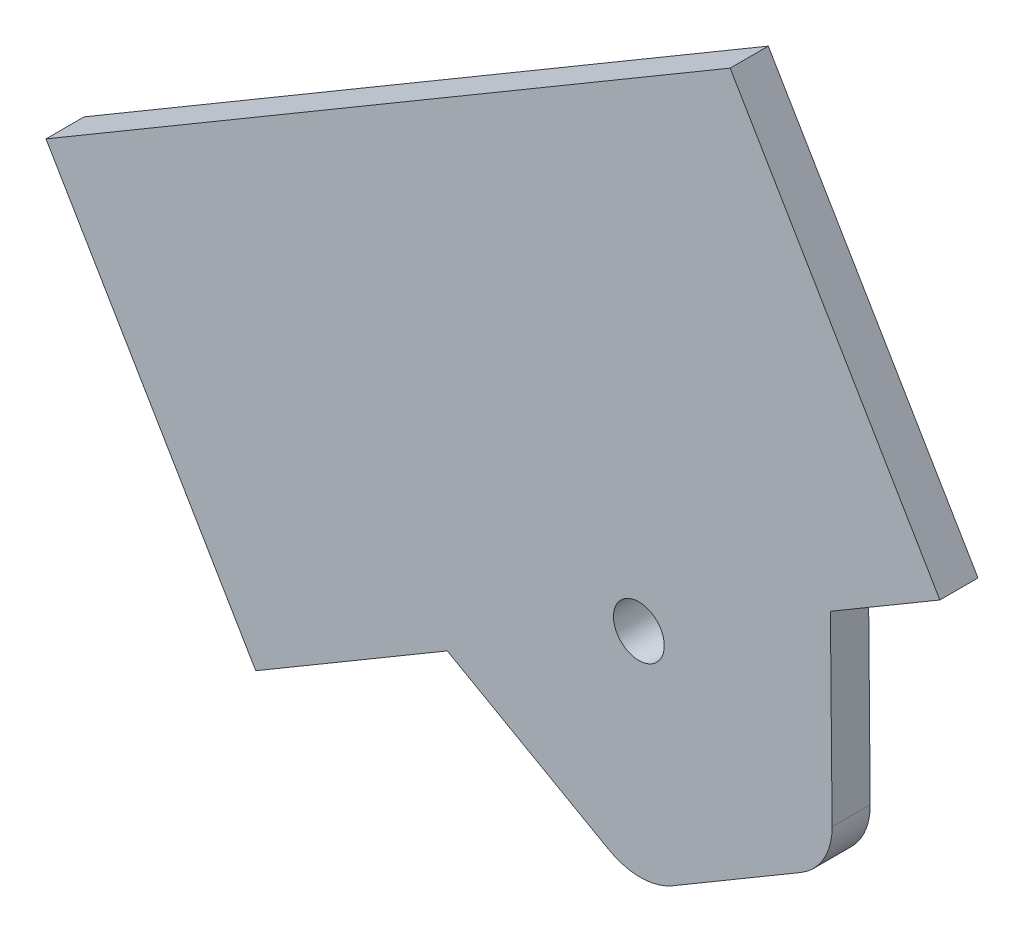
ISO-10303-21;
HEADER;
FILE_DESCRIPTION(('STEP AP214'),'2;1');
FILE_NAME('part.step','',(''),(''),'','','');
FILE_SCHEMA(('AUTOMOTIVE_DESIGN { 1 0 10303 214 1 1 1 1 }'));
ENDSEC;
DATA;
#1=APPLICATION_CONTEXT('core data for automotive mechanical design processes');
#2=APPLICATION_PROTOCOL_DEFINITION('international standard','automotive_design',2000,#1);
#3=PRODUCT_CONTEXT('',#1,'mechanical');
#4=PRODUCT('Part','Part','',(#3));
#5=PRODUCT_RELATED_PRODUCT_CATEGORY('part','',(#4));
#6=PRODUCT_DEFINITION_FORMATION('','',#4);
#7=PRODUCT_DEFINITION_CONTEXT('part definition',#1,'design');
#8=PRODUCT_DEFINITION('design','',#6,#7);
#9=PRODUCT_DEFINITION_SHAPE('','',#8);
#10=(LENGTH_UNIT() NAMED_UNIT(*) SI_UNIT(.MILLI.,.METRE.));
#11=(NAMED_UNIT(*) PLANE_ANGLE_UNIT() SI_UNIT($,.RADIAN.));
#12=(NAMED_UNIT(*) SI_UNIT($,.STERADIAN.) SOLID_ANGLE_UNIT());
#13=UNCERTAINTY_MEASURE_WITH_UNIT(LENGTH_MEASURE(1.E-05),#10,'distance_accuracy_value','');
#14=(GEOMETRIC_REPRESENTATION_CONTEXT(3) GLOBAL_UNCERTAINTY_ASSIGNED_CONTEXT((#13)) GLOBAL_UNIT_ASSIGNED_CONTEXT((#10,
#11,#12)) REPRESENTATION_CONTEXT('',''));
#15=CARTESIAN_POINT('',(0.,0.,0.));
#16=DIRECTION('',(0.,0.,1.));
#17=DIRECTION('',(1.,0.,0.));
#18=AXIS2_PLACEMENT_3D('',#15,#16,#17);
#19=CARTESIAN_POINT('',(48.5215928811071,334.718954291785,6.));
#20=DIRECTION('',(0.,0.,1.));
#21=DIRECTION('',(1.,0.,0.));
#22=AXIS2_PLACEMENT_3D('',#19,#20,#21);
#23=PLANE('',#22);
#24=DIRECTION('',(0.861436542464988,0.507865221595225,0.));
#25=VECTOR('',#24,1.);
#26=CARTESIAN_POINT('',(78.4583109537115,375.946259310141,6.));
#27=LINE('',#26,#25);
#28=CARTESIAN_POINT('',(78.4583109537115,375.946259310141,6.));
#29=VERTEX_POINT('',#28);
#30=CARTESIAN_POINT('',(95.6870418030112,386.103563742045,6.));
#31=VERTEX_POINT('',#30);
#32=EDGE_CURVE('E168',#29,#31,#27,.T.);
#33=ORIENTED_EDGE('',*,*,#32,.T.);
#34=DIRECTION('',(-0.507865221595228,0.861436542464986,0.));
#35=VECTOR('',#34,1.);
#36=CARTESIAN_POINT('',(95.6870418030112,386.103563742045,6.));
#37=LINE('',#36,#35);
#38=CARTESIAN_POINT('',(62.6758023993214,442.096939002269,6.));
#39=VERTEX_POINT('',#38);
#40=EDGE_CURVE('E106',#31,#39,#37,.T.);
#41=ORIENTED_EDGE('',*,*,#40,.T.);
#42=DIRECTION('',(-0.861436542465423,-0.507865221594487,0.));
#43=VECTOR('',#42,1.);
#44=CARTESIAN_POINT('',(62.6758023993214,442.096939002269,6.));
#45=LINE('',#44,#43);
#46=CARTESIAN_POINT('',(-45.0037654088565,378.613786302958,6.));
#47=VERTEX_POINT('',#46);
#48=EDGE_CURVE('E189',#39,#47,#45,.T.);
#49=ORIENTED_EDGE('',*,*,#48,.T.);
#50=DIRECTION('',(0.507865221595247,-0.861436542464975,0.));
#51=VECTOR('',#50,1.);
#52=CARTESIAN_POINT('',(-45.0037654088565,378.613786302958,6.));
#53=LINE('',#52,#51);
#54=CARTESIAN_POINT('',(-11.9925260051655,322.620411042735,6.));
#55=VERTEX_POINT('',#54);
#56=EDGE_CURVE('E208',#47,#55,#53,.T.);
#57=ORIENTED_EDGE('',*,*,#56,.T.);
#58=DIRECTION('',(0.861436542464983,0.507865221595234,0.));
#59=VECTOR('',#58,1.);
#60=CARTESIAN_POINT('',(-11.9925260051655,322.620411042735,6.));
#61=LINE('',#60,#59);
#62=CARTESIAN_POINT('',(18.1577529811089,340.395693798568,6.));
#63=VERTEX_POINT('',#62);
#64=EDGE_CURVE('E205',#55,#63,#61,.T.);
#65=ORIENTED_EDGE('',*,*,#64,.T.);
#66=DIRECTION('',(0.870542454831801,-0.492093318726663,0.));
#67=VECTOR('',#66,1.);
#68=CARTESIAN_POINT('',(18.1577529811089,340.395693798568,6.));
#69=LINE('',#68,#67);
#70=CARTESIAN_POINT('',(43.6006596938402,326.013529743468,6.));
#71=VERTEX_POINT('',#70);
#72=EDGE_CURVE('E207',#63,#71,#69,.T.);
#73=ORIENTED_EDGE('',*,*,#72,.T.);
#74=CARTESIAN_POINT('',(48.5215928811071,334.718954291785,6.));
#75=DIRECTION('',(0.,0.,1.));
#76=DIRECTION('',(1.,0.,0.));
#77=AXIS2_PLACEMENT_3D('',#74,#75,#76);
#78=CIRCLE('',#77,9.99999999999959);
#79=CARTESIAN_POINT('',(53.6002450970461,326.104588867128,6.));
#80=VERTEX_POINT('',#79);
#81=EDGE_CURVE('E131',#71,#80,#78,.T.);
#82=ORIENTED_EDGE('',*,*,#81,.T.);
#83=DIRECTION('',(0.861436542465769,0.5078652215939,0.));
#84=VECTOR('',#83,1.);
#85=CARTESIAN_POINT('',(53.6002450970461,326.104588867128,6.));
#86=LINE('',#85,#84);
#87=CARTESIAN_POINT('',(73.8035116896998,338.015549174929,6.));
#88=VERTEX_POINT('',#87);
#89=EDGE_CURVE('E125',#80,#88,#86,.T.);
#90=ORIENTED_EDGE('',*,*,#89,.T.);
#91=CARTESIAN_POINT('',(68.7248594737608,346.629914599586,6.));
#92=DIRECTION('',(0.,0.,1.));
#93=DIRECTION('',(1.,0.,0.));
#94=AXIS2_PLACEMENT_3D('',#91,#92,#93);
#95=CIRCLE('',#94,9.99999999999988);
#96=CARTESIAN_POINT('',(78.724444876966,346.720973723247,6.));
#97=VERTEX_POINT('',#96);
#98=EDGE_CURVE('E129',#88,#97,#95,.T.);
#99=ORIENTED_EDGE('',*,*,#98,.T.);
#100=DIRECTION('',(-0.00910591236607605,0.999958540320538,0.));
#101=VECTOR('',#100,1.);
#102=CARTESIAN_POINT('',(78.7244448769664,346.720973723247,6.));
#103=LINE('',#102,#101);
#104=EDGE_CURVE('E57',#97,#29,#103,.T.);
#105=ORIENTED_EDGE('',*,*,#104,.T.);
#106=EDGE_LOOP('',(#33,#41,#49,#57,#65,#73,#82,#90,#99,#105));
#107=FACE_BOUND('',#106,.T.);
#108=CARTESIAN_POINT('',(48.3080319674108,358.170976554355,6.));
#109=DIRECTION('',(0.,0.,1.));
#110=DIRECTION('',(1.,0.,0.));
#111=AXIS2_PLACEMENT_3D('',#108,#109,#110);
#112=CIRCLE('',#111,3.99999999998749);
#113=CARTESIAN_POINT('',(52.3080319673983,358.170976554355,6.));
#114=VERTEX_POINT('',#113);
#115=EDGE_CURVE('E153',#114,#114,#112,.T.);
#116=ORIENTED_EDGE('',*,*,#115,.F.);
#117=EDGE_LOOP('',(#116));
#118=FACE_BOUND('',#117,.T.);
#119=ADVANCED_FACE('F40',(#107,#118),#23,.T.);
#120=CARTESIAN_POINT('',(48.5215928811071,334.718954291785,0.));
#121=DIRECTION('',(0.,0.,1.));
#122=DIRECTION('',(1.,0.,0.));
#123=AXIS2_PLACEMENT_3D('',#120,#121,#122);
#124=PLANE('',#123);
#125=DIRECTION('',(0.861436542464988,0.507865221595225,0.));
#126=VECTOR('',#125,1.);
#127=CARTESIAN_POINT('',(78.4583109537115,375.946259310141,0.));
#128=LINE('',#127,#126);
#129=CARTESIAN_POINT('',(78.4583109537115,375.946259310141,0.));
#130=VERTEX_POINT('',#129);
#131=CARTESIAN_POINT('',(95.6870418030112,386.103563742045,0.));
#132=VERTEX_POINT('',#131);
#133=EDGE_CURVE('E149',#130,#132,#128,.T.);
#134=ORIENTED_EDGE('',*,*,#133,.F.);
#135=DIRECTION('',(-0.00910591236607605,0.999958540320538,0.));
#136=VECTOR('',#135,1.);
#137=CARTESIAN_POINT('',(78.7244448769664,346.720973723247,0.));
#138=LINE('',#137,#136);
#139=CARTESIAN_POINT('',(78.724444876966,346.720973723247,0.));
#140=VERTEX_POINT('',#139);
#141=EDGE_CURVE('E98',#140,#130,#138,.T.);
#142=ORIENTED_EDGE('',*,*,#141,.F.);
#143=CARTESIAN_POINT('',(68.7248594737608,346.629914599586,0.));
#144=DIRECTION('',(0.,0.,1.));
#145=DIRECTION('',(1.,0.,0.));
#146=AXIS2_PLACEMENT_3D('',#143,#144,#145);
#147=CIRCLE('',#146,9.99999999999988);
#148=CARTESIAN_POINT('',(73.8035116896998,338.015549174929,0.));
#149=VERTEX_POINT('',#148);
#150=EDGE_CURVE('E92',#149,#140,#147,.T.);
#151=ORIENTED_EDGE('',*,*,#150,.F.);
#152=DIRECTION('',(0.861436542465769,0.5078652215939,0.));
#153=VECTOR('',#152,1.);
#154=CARTESIAN_POINT('',(53.6002450970461,326.104588867128,0.));
#155=LINE('',#154,#153);
#156=CARTESIAN_POINT('',(53.6002450970461,326.104588867128,0.));
#157=VERTEX_POINT('',#156);
#158=EDGE_CURVE('E139',#157,#149,#155,.T.);
#159=ORIENTED_EDGE('',*,*,#158,.F.);
#160=CARTESIAN_POINT('',(48.5215928811071,334.718954291785,0.));
#161=DIRECTION('',(0.,0.,1.));
#162=DIRECTION('',(1.,0.,0.));
#163=AXIS2_PLACEMENT_3D('',#160,#161,#162);
#164=CIRCLE('',#163,9.99999999999959);
#165=CARTESIAN_POINT('',(43.6006596938402,326.013529743468,0.));
#166=VERTEX_POINT('',#165);
#167=EDGE_CURVE('E163',#166,#157,#164,.T.);
#168=ORIENTED_EDGE('',*,*,#167,.F.);
#169=DIRECTION('',(0.870542454831801,-0.492093318726663,0.));
#170=VECTOR('',#169,1.);
#171=CARTESIAN_POINT('',(18.1577529811089,340.395693798568,0.));
#172=LINE('',#171,#170);
#173=CARTESIAN_POINT('',(18.1577529811089,340.395693798568,0.));
#174=VERTEX_POINT('',#173);
#175=EDGE_CURVE('E161',#174,#166,#172,.T.);
#176=ORIENTED_EDGE('',*,*,#175,.F.);
#177=DIRECTION('',(0.861436542464983,0.507865221595234,0.));
#178=VECTOR('',#177,1.);
#179=CARTESIAN_POINT('',(-11.9925260051655,322.620411042735,0.));
#180=LINE('',#179,#178);
#181=CARTESIAN_POINT('',(-11.9925260051655,322.620411042735,0.));
#182=VERTEX_POINT('',#181);
#183=EDGE_CURVE('E159',#182,#174,#180,.T.);
#184=ORIENTED_EDGE('',*,*,#183,.F.);
#185=DIRECTION('',(0.507865221595247,-0.861436542464975,0.));
#186=VECTOR('',#185,1.);
#187=CARTESIAN_POINT('',(-45.0037654088565,378.613786302958,0.));
#188=LINE('',#187,#186);
#189=CARTESIAN_POINT('',(-45.0037654088565,378.613786302958,0.));
#190=VERTEX_POINT('',#189);
#191=EDGE_CURVE('E157',#190,#182,#188,.T.);
#192=ORIENTED_EDGE('',*,*,#191,.F.);
#193=DIRECTION('',(-0.861436542465423,-0.507865221594487,0.));
#194=VECTOR('',#193,1.);
#195=CARTESIAN_POINT('',(62.6758023993214,442.096939002269,0.));
#196=LINE('',#195,#194);
#197=CARTESIAN_POINT('',(62.6758023993214,442.096939002269,0.));
#198=VERTEX_POINT('',#197);
#199=EDGE_CURVE('E155',#198,#190,#196,.T.);
#200=ORIENTED_EDGE('',*,*,#199,.F.);
#201=DIRECTION('',(-0.507865221595228,0.861436542464986,0.));
#202=VECTOR('',#201,1.);
#203=CARTESIAN_POINT('',(95.6870418030112,386.103563742045,0.));
#204=LINE('',#203,#202);
#205=EDGE_CURVE('E152',#132,#198,#204,.T.);
#206=ORIENTED_EDGE('',*,*,#205,.F.);
#207=EDGE_LOOP('',(#134,#142,#151,#159,#168,#176,#184,#192,#200,#206));
#208=FACE_BOUND('',#207,.T.);
#209=CARTESIAN_POINT('',(48.3080319674108,358.170976554355,0.));
#210=DIRECTION('',(0.,0.,1.));
#211=DIRECTION('',(1.,0.,0.));
#212=AXIS2_PLACEMENT_3D('',#209,#210,#211);
#213=CIRCLE('',#212,3.99999999998749);
#214=CARTESIAN_POINT('',(52.3080319673983,358.170976554355,0.));
#215=VERTEX_POINT('',#214);
#216=EDGE_CURVE('E216',#215,#215,#213,.T.);
#217=ORIENTED_EDGE('',*,*,#216,.T.);
#218=EDGE_LOOP('',(#217));
#219=FACE_BOUND('',#218,.T.);
#220=ADVANCED_FACE('F193',(#208,#219),#124,.F.);
#221=CARTESIAN_POINT('',(78.4583109537115,375.946259310141,6.));
#222=DIRECTION('',(-0.507865221595225,0.861436542464988,0.));
#223=DIRECTION('',(-0.861436542464988,-0.507865221595225,0.));
#224=AXIS2_PLACEMENT_3D('',#221,#222,#223);
#225=PLANE('',#224);
#226=ORIENTED_EDGE('',*,*,#133,.T.);
#227=DIRECTION('',(0.,0.,-1.));
#228=VECTOR('',#227,1.);
#229=CARTESIAN_POINT('',(95.6870418030112,386.103563742045,6.));
#230=LINE('',#229,#228);
#231=EDGE_CURVE('E11',#31,#132,#230,.T.);
#232=ORIENTED_EDGE('',*,*,#231,.F.);
#233=ORIENTED_EDGE('',*,*,#32,.F.);
#234=DIRECTION('',(0.,0.,-1.));
#235=VECTOR('',#234,1.);
#236=CARTESIAN_POINT('',(78.4583109537115,375.946259310141,6.));
#237=LINE('',#236,#235);
#238=EDGE_CURVE('E145',#29,#130,#237,.T.);
#239=ORIENTED_EDGE('',*,*,#238,.T.);
#240=EDGE_LOOP('',(#226,#232,#233,#239));
#241=FACE_BOUND('',#240,.T.);
#242=ADVANCED_FACE('F42',(#241),#225,.F.);
#243=CARTESIAN_POINT('',(95.6870418030112,386.103563742045,6.));
#244=DIRECTION('',(-0.861436542464986,-0.507865221595228,0.));
#245=DIRECTION('',(0.507865221595228,-0.861436542464986,0.));
#246=AXIS2_PLACEMENT_3D('',#243,#244,#245);
#247=PLANE('',#246);
#248=ORIENTED_EDGE('',*,*,#205,.T.);
#249=DIRECTION('',(0.,0.,-1.));
#250=VECTOR('',#249,1.);
#251=CARTESIAN_POINT('',(62.6758023993214,442.096939002269,6.));
#252=LINE('',#251,#250);
#253=EDGE_CURVE('E49',#39,#198,#252,.T.);
#254=ORIENTED_EDGE('',*,*,#253,.F.);
#255=ORIENTED_EDGE('',*,*,#40,.F.);
#256=ORIENTED_EDGE('',*,*,#231,.T.);
#257=EDGE_LOOP('',(#248,#254,#255,#256));
#258=FACE_BOUND('',#257,.T.);
#259=ADVANCED_FACE('F252',(#258),#247,.F.);
#260=CARTESIAN_POINT('',(62.6758023993214,442.096939002269,6.));
#261=DIRECTION('',(0.507865221594487,-0.861436542465423,0.));
#262=DIRECTION('',(0.861436542465423,0.507865221594487,0.));
#263=AXIS2_PLACEMENT_3D('',#260,#261,#262);
#264=PLANE('',#263);
#265=ORIENTED_EDGE('',*,*,#199,.T.);
#266=DIRECTION('',(0.,0.,-1.));
#267=VECTOR('',#266,1.);
#268=CARTESIAN_POINT('',(-45.0037654088565,378.613786302958,6.));
#269=LINE('',#268,#267);
#270=EDGE_CURVE('E181',#47,#190,#269,.T.);
#271=ORIENTED_EDGE('',*,*,#270,.F.);
#272=ORIENTED_EDGE('',*,*,#48,.F.);
#273=ORIENTED_EDGE('',*,*,#253,.T.);
#274=EDGE_LOOP('',(#265,#271,#272,#273));
#275=FACE_BOUND('',#274,.T.);
#276=ADVANCED_FACE('F187',(#275),#264,.F.);
#277=CARTESIAN_POINT('',(-45.0037654088565,378.613786302958,6.));
#278=DIRECTION('',(0.861436542464975,0.507865221595247,0.));
#279=DIRECTION('',(-0.507865221595247,0.861436542464975,0.));
#280=AXIS2_PLACEMENT_3D('',#277,#278,#279);
#281=PLANE('',#280);
#282=ORIENTED_EDGE('',*,*,#191,.T.);
#283=DIRECTION('',(0.,0.,-1.));
#284=VECTOR('',#283,1.);
#285=CARTESIAN_POINT('',(-11.9925260051655,322.620411042735,6.));
#286=LINE('',#285,#284);
#287=EDGE_CURVE('E178',#55,#182,#286,.T.);
#288=ORIENTED_EDGE('',*,*,#287,.F.);
#289=ORIENTED_EDGE('',*,*,#56,.F.);
#290=ORIENTED_EDGE('',*,*,#270,.T.);
#291=EDGE_LOOP('',(#282,#288,#289,#290));
#292=FACE_BOUND('',#291,.T.);
#293=ADVANCED_FACE('F199',(#292),#281,.F.);
#294=CARTESIAN_POINT('',(-11.9925260051655,322.620411042735,6.));
#295=DIRECTION('',(-0.507865221595234,0.861436542464983,0.));
#296=DIRECTION('',(-0.861436542464983,-0.507865221595234,0.));
#297=AXIS2_PLACEMENT_3D('',#294,#295,#296);
#298=PLANE('',#297);
#299=ORIENTED_EDGE('',*,*,#183,.T.);
#300=DIRECTION('',(0.,0.,-1.));
#301=VECTOR('',#300,1.);
#302=CARTESIAN_POINT('',(18.1577529811089,340.395693798568,6.));
#303=LINE('',#302,#301);
#304=EDGE_CURVE('E175',#63,#174,#303,.T.);
#305=ORIENTED_EDGE('',*,*,#304,.F.);
#306=ORIENTED_EDGE('',*,*,#64,.F.);
#307=ORIENTED_EDGE('',*,*,#287,.T.);
#308=EDGE_LOOP('',(#299,#305,#306,#307));
#309=FACE_BOUND('',#308,.T.);
#310=ADVANCED_FACE('F203',(#309),#298,.F.);
#311=CARTESIAN_POINT('',(18.1577529811089,340.395693798568,6.));
#312=DIRECTION('',(0.492093318726663,0.870542454831801,0.));
#313=DIRECTION('',(-0.870542454831801,0.492093318726663,0.));
#314=AXIS2_PLACEMENT_3D('',#311,#312,#313);
#315=PLANE('',#314);
#316=ORIENTED_EDGE('',*,*,#175,.T.);
#317=DIRECTION('',(0.,0.,-1.));
#318=VECTOR('',#317,1.);
#319=CARTESIAN_POINT('',(43.6006596938402,326.013529743468,6.));
#320=LINE('',#319,#318);
#321=EDGE_CURVE('E172',#71,#166,#320,.T.);
#322=ORIENTED_EDGE('',*,*,#321,.F.);
#323=ORIENTED_EDGE('',*,*,#72,.F.);
#324=ORIENTED_EDGE('',*,*,#304,.T.);
#325=EDGE_LOOP('',(#316,#322,#323,#324));
#326=FACE_BOUND('',#325,.T.);
#327=ADVANCED_FACE('F242',(#326),#315,.F.);
#328=CARTESIAN_POINT('',(48.5215928811071,334.718954291785,6.));
#329=DIRECTION('',(0.,0.,-1.));
#330=DIRECTION('',(-1.,0.,0.));
#331=AXIS2_PLACEMENT_3D('',#328,#329,#330);
#332=CYLINDRICAL_SURFACE('',#331,9.99999999999959);
#333=ORIENTED_EDGE('',*,*,#167,.T.);
#334=DIRECTION('',(0.,0.,-1.));
#335=VECTOR('',#334,1.);
#336=CARTESIAN_POINT('',(53.6002450970461,326.104588867128,6.));
#337=LINE('',#336,#335);
#338=EDGE_CURVE('E140',#80,#157,#337,.T.);
#339=ORIENTED_EDGE('',*,*,#338,.F.);
#340=ORIENTED_EDGE('',*,*,#81,.F.);
#341=ORIENTED_EDGE('',*,*,#321,.T.);
#342=EDGE_LOOP('',(#333,#339,#340,#341));
#343=FACE_BOUND('',#342,.T.);
#344=ADVANCED_FACE('F239',(#343),#332,.T.);
#345=CARTESIAN_POINT('',(53.6002450970461,326.104588867128,6.));
#346=DIRECTION('',(-0.5078652215939,0.861436542465769,0.));
#347=DIRECTION('',(-0.861436542465769,-0.5078652215939,0.));
#348=AXIS2_PLACEMENT_3D('',#345,#346,#347);
#349=PLANE('',#348);
#350=ORIENTED_EDGE('',*,*,#158,.T.);
#351=DIRECTION('',(0.,0.,-1.));
#352=VECTOR('',#351,1.);
#353=CARTESIAN_POINT('',(73.8035116896998,338.015549174929,6.));
#354=LINE('',#353,#352);
#355=EDGE_CURVE('E136',#88,#149,#354,.T.);
#356=ORIENTED_EDGE('',*,*,#355,.F.);
#357=ORIENTED_EDGE('',*,*,#89,.F.);
#358=ORIENTED_EDGE('',*,*,#338,.T.);
#359=EDGE_LOOP('',(#350,#356,#357,#358));
#360=FACE_BOUND('',#359,.T.);
#361=ADVANCED_FACE('F137',(#360),#349,.F.);
#362=CARTESIAN_POINT('',(68.7248594737608,346.629914599586,6.));
#363=DIRECTION('',(0.,0.,-1.));
#364=DIRECTION('',(-1.,0.,0.));
#365=AXIS2_PLACEMENT_3D('',#362,#363,#364);
#366=CYLINDRICAL_SURFACE('',#365,9.99999999999988);
#367=ORIENTED_EDGE('',*,*,#150,.T.);
#368=DIRECTION('',(0.,0.,-1.));
#369=VECTOR('',#368,1.);
#370=CARTESIAN_POINT('',(78.724444876966,346.720973723247,6.));
#371=LINE('',#370,#369);
#372=EDGE_CURVE('E141',#97,#140,#371,.T.);
#373=ORIENTED_EDGE('',*,*,#372,.F.);
#374=ORIENTED_EDGE('',*,*,#98,.F.);
#375=ORIENTED_EDGE('',*,*,#355,.T.);
#376=EDGE_LOOP('',(#367,#373,#374,#375));
#377=FACE_BOUND('',#376,.T.);
#378=ADVANCED_FACE('F143',(#377),#366,.T.);
#379=CARTESIAN_POINT('',(78.7244448769664,346.720973723247,6.));
#380=DIRECTION('',(-0.999958540320538,-0.00910591236607605,0.));
#381=DIRECTION('',(0.00910591236607605,-0.999958540320538,0.));
#382=AXIS2_PLACEMENT_3D('',#379,#380,#381);
#383=PLANE('',#382);
#384=ORIENTED_EDGE('',*,*,#141,.T.);
#385=ORIENTED_EDGE('',*,*,#238,.F.);
#386=ORIENTED_EDGE('',*,*,#104,.F.);
#387=ORIENTED_EDGE('',*,*,#372,.T.);
#388=EDGE_LOOP('',(#384,#385,#386,#387));
#389=FACE_BOUND('',#388,.T.);
#390=ADVANCED_FACE('F232',(#389),#383,.F.);
#391=CARTESIAN_POINT('',(48.3080319674108,358.170976554355,6.));
#392=DIRECTION('',(0.,0.,-1.));
#393=DIRECTION('',(-1.,0.,0.));
#394=AXIS2_PLACEMENT_3D('',#391,#392,#393);
#395=CYLINDRICAL_SURFACE('',#394,3.99999999998749);
#396=ORIENTED_EDGE('',*,*,#115,.T.);
#397=EDGE_LOOP('',(#396));
#398=FACE_BOUND('',#397,.T.);
#399=ORIENTED_EDGE('',*,*,#216,.F.);
#400=EDGE_LOOP('',(#399));
#401=FACE_BOUND('',#400,.T.);
#402=ADVANCED_FACE('F222',(#398,#401),#395,.F.);
#403=CLOSED_SHELL('',(#119,#220,#242,#259,#276,#293,#310,#327,#344,#361,#378,#390,#402));
#404=MANIFOLD_SOLID_BREP('B2',#403);
#405=ADVANCED_BREP_SHAPE_REPRESENTATION('',(#18,#404),#14);
#406=SHAPE_DEFINITION_REPRESENTATION(#9,#405);
ENDSEC;
END-ISO-10303-21;
